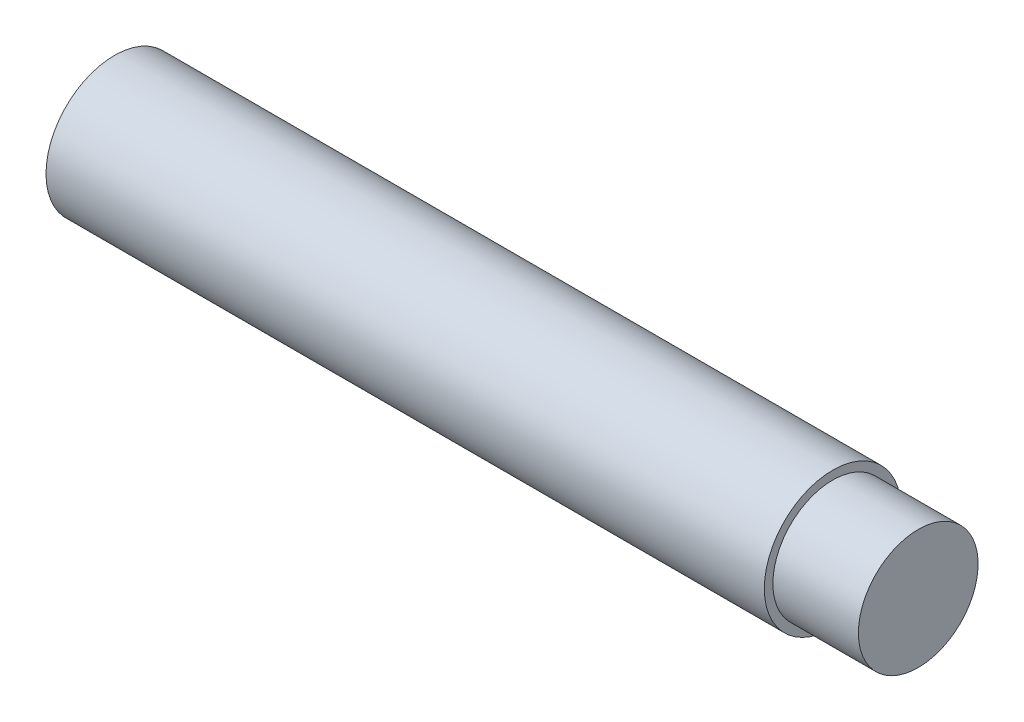
ISO-10303-21;
HEADER;
FILE_DESCRIPTION(('STEP AP214'),'2;1');
FILE_NAME('part.step','',(''),(''),'','','');
FILE_SCHEMA(('AUTOMOTIVE_DESIGN { 1 0 10303 214 1 1 1 1 }'));
ENDSEC;
DATA;
#1=APPLICATION_CONTEXT('core data for automotive mechanical design processes');
#2=APPLICATION_PROTOCOL_DEFINITION('international standard','automotive_design',2000,#1);
#3=PRODUCT_CONTEXT('',#1,'mechanical');
#4=PRODUCT('Part','Part','',(#3));
#5=PRODUCT_RELATED_PRODUCT_CATEGORY('part','',(#4));
#6=PRODUCT_DEFINITION_FORMATION('','',#4);
#7=PRODUCT_DEFINITION_CONTEXT('part definition',#1,'design');
#8=PRODUCT_DEFINITION('design','',#6,#7);
#9=PRODUCT_DEFINITION_SHAPE('','',#8);
#10=(LENGTH_UNIT() NAMED_UNIT(*) SI_UNIT(.MILLI.,.METRE.));
#11=(NAMED_UNIT(*) PLANE_ANGLE_UNIT() SI_UNIT($,.RADIAN.));
#12=(NAMED_UNIT(*) SI_UNIT($,.STERADIAN.) SOLID_ANGLE_UNIT());
#13=UNCERTAINTY_MEASURE_WITH_UNIT(LENGTH_MEASURE(1.E-05),#10,'distance_accuracy_value','');
#14=(GEOMETRIC_REPRESENTATION_CONTEXT(3) GLOBAL_UNCERTAINTY_ASSIGNED_CONTEXT((#13)) GLOBAL_UNIT_ASSIGNED_CONTEXT((#10,
#11,#12)) REPRESENTATION_CONTEXT('',''));
#15=CARTESIAN_POINT('',(0.,0.,0.));
#16=DIRECTION('',(0.,0.,1.));
#17=DIRECTION('',(1.,0.,0.));
#18=AXIS2_PLACEMENT_3D('',#15,#16,#17);
#19=CARTESIAN_POINT('',(-23.5,4.,0.));
#20=DIRECTION('',(1.,0.,0.));
#21=DIRECTION('',(0.,0.,-1.));
#22=AXIS2_PLACEMENT_3D('',#19,#20,#21);
#23=PLANE('',#22);
#24=CARTESIAN_POINT('',(-23.5,0.,0.));
#25=DIRECTION('',(-1.,0.,0.));
#26=DIRECTION('',(0.,0.,1.));
#27=AXIS2_PLACEMENT_3D('',#24,#25,#26);
#28=CIRCLE('',#27,4.);
#29=CARTESIAN_POINT('',(-23.5,0.,4.));
#30=VERTEX_POINT('',#29);
#31=EDGE_CURVE('E10',#30,#30,#28,.T.);
#32=ORIENTED_EDGE('',*,*,#31,.T.);
#33=EDGE_LOOP('',(#32));
#34=FACE_BOUND('',#33,.T.);
#35=ADVANCED_FACE('F35',(#34),#23,.F.);
#36=CARTESIAN_POINT('',(-23.5,0.,0.));
#37=DIRECTION('',(-1.,0.,0.));
#38=DIRECTION('',(0.,0.,1.));
#39=AXIS2_PLACEMENT_3D('',#36,#37,#38);
#40=CYLINDRICAL_SURFACE('',#39,4.);
#41=ORIENTED_EDGE('',*,*,#31,.F.);
#42=EDGE_LOOP('',(#41));
#43=FACE_BOUND('',#42,.T.);
#44=CARTESIAN_POINT('',(18.5,0.,0.));
#45=DIRECTION('',(-1.,0.,0.));
#46=DIRECTION('',(0.,0.,1.));
#47=AXIS2_PLACEMENT_3D('',#44,#45,#46);
#48=CIRCLE('',#47,4.);
#49=CARTESIAN_POINT('',(18.5,0.,4.));
#50=VERTEX_POINT('',#49);
#51=EDGE_CURVE('E41',#50,#50,#48,.T.);
#52=ORIENTED_EDGE('',*,*,#51,.T.);
#53=EDGE_LOOP('',(#52));
#54=FACE_BOUND('',#53,.T.);
#55=ADVANCED_FACE('F67',(#43,#54),#40,.T.);
#56=CARTESIAN_POINT('',(18.5,4.,0.));
#57=DIRECTION('',(-1.,0.,0.));
#58=DIRECTION('',(0.,0.,1.));
#59=AXIS2_PLACEMENT_3D('',#56,#57,#58);
#60=PLANE('',#59);
#61=ORIENTED_EDGE('',*,*,#51,.F.);
#62=EDGE_LOOP('',(#61));
#63=FACE_BOUND('',#62,.T.);
#64=CARTESIAN_POINT('',(18.5,0.,0.));
#65=DIRECTION('',(-1.,0.,0.));
#66=DIRECTION('',(0.,0.,1.));
#67=AXIS2_PLACEMENT_3D('',#64,#65,#66);
#68=CIRCLE('',#67,3.5);
#69=CARTESIAN_POINT('',(18.5,0.,3.5));
#70=VERTEX_POINT('',#69);
#71=EDGE_CURVE('E45',#70,#70,#68,.T.);
#72=ORIENTED_EDGE('',*,*,#71,.T.);
#73=EDGE_LOOP('',(#72));
#74=FACE_BOUND('',#73,.T.);
#75=ADVANCED_FACE('F63',(#63,#74),#60,.F.);
#76=CARTESIAN_POINT('',(-23.5,0.,0.));
#77=DIRECTION('',(-1.,0.,0.));
#78=DIRECTION('',(0.,0.,1.));
#79=AXIS2_PLACEMENT_3D('',#76,#77,#78);
#80=CYLINDRICAL_SURFACE('',#79,3.5);
#81=ORIENTED_EDGE('',*,*,#71,.F.);
#82=EDGE_LOOP('',(#81));
#83=FACE_BOUND('',#82,.T.);
#84=CARTESIAN_POINT('',(23.5,0.,0.));
#85=DIRECTION('',(-1.,0.,0.));
#86=DIRECTION('',(0.,0.,1.));
#87=AXIS2_PLACEMENT_3D('',#84,#85,#86);
#88=CIRCLE('',#87,3.5);
#89=CARTESIAN_POINT('',(23.5,0.,3.5));
#90=VERTEX_POINT('',#89);
#91=EDGE_CURVE('E49',#90,#90,#88,.T.);
#92=ORIENTED_EDGE('',*,*,#91,.T.);
#93=EDGE_LOOP('',(#92));
#94=FACE_BOUND('',#93,.T.);
#95=ADVANCED_FACE('F55',(#83,#94),#80,.T.);
#96=CARTESIAN_POINT('',(23.5,3.5,0.));
#97=DIRECTION('',(-1.,0.,0.));
#98=DIRECTION('',(0.,0.,1.));
#99=AXIS2_PLACEMENT_3D('',#96,#97,#98);
#100=PLANE('',#99);
#101=ORIENTED_EDGE('',*,*,#91,.F.);
#102=EDGE_LOOP('',(#101));
#103=FACE_BOUND('',#102,.T.);
#104=ADVANCED_FACE('F57',(#103),#100,.F.);
#105=CLOSED_SHELL('',(#35,#55,#75,#95,#104));
#106=MANIFOLD_SOLID_BREP('B2',#105);
#107=ADVANCED_BREP_SHAPE_REPRESENTATION('',(#18,#106),#14);
#108=SHAPE_DEFINITION_REPRESENTATION(#9,#107);
ENDSEC;
END-ISO-10303-21;
